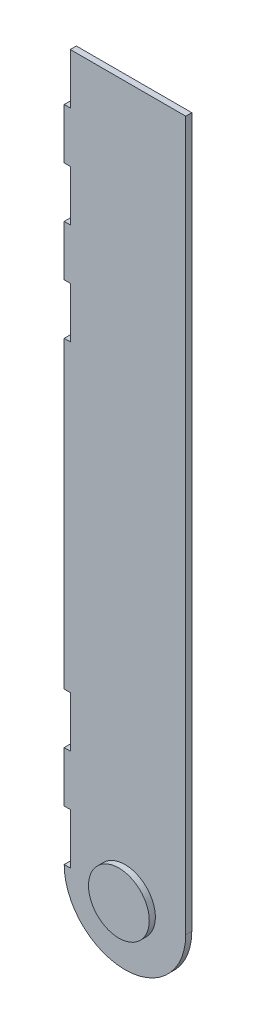
ISO-10303-21;
HEADER;
FILE_DESCRIPTION(('STEP AP214'),'2;1');
FILE_NAME('part.step','',(''),(''),'','','');
FILE_SCHEMA(('AUTOMOTIVE_DESIGN { 1 0 10303 214 1 1 1 1 }'));
ENDSEC;
DATA;
#1=APPLICATION_CONTEXT('core data for automotive mechanical design processes');
#2=APPLICATION_PROTOCOL_DEFINITION('international standard','automotive_design',2000,#1);
#3=PRODUCT_CONTEXT('',#1,'mechanical');
#4=PRODUCT('Part','Part','',(#3));
#5=PRODUCT_RELATED_PRODUCT_CATEGORY('part','',(#4));
#6=PRODUCT_DEFINITION_FORMATION('','',#4);
#7=PRODUCT_DEFINITION_CONTEXT('part definition',#1,'design');
#8=PRODUCT_DEFINITION('design','',#6,#7);
#9=PRODUCT_DEFINITION_SHAPE('','',#8);
#10=(LENGTH_UNIT() NAMED_UNIT(*) SI_UNIT(.MILLI.,.METRE.));
#11=(NAMED_UNIT(*) PLANE_ANGLE_UNIT() SI_UNIT($,.RADIAN.));
#12=(NAMED_UNIT(*) SI_UNIT($,.STERADIAN.) SOLID_ANGLE_UNIT());
#13=UNCERTAINTY_MEASURE_WITH_UNIT(LENGTH_MEASURE(1.E-05),#10,'distance_accuracy_value','');
#14=(GEOMETRIC_REPRESENTATION_CONTEXT(3) GLOBAL_UNCERTAINTY_ASSIGNED_CONTEXT((#13)) GLOBAL_UNIT_ASSIGNED_CONTEXT((#10,
#11,#12)) REPRESENTATION_CONTEXT('',''));
#15=CARTESIAN_POINT('',(0.,0.,0.));
#16=DIRECTION('',(0.,0.,1.));
#17=DIRECTION('',(1.,0.,0.));
#18=AXIS2_PLACEMENT_3D('',#15,#16,#17);
#19=CARTESIAN_POINT('',(0.,0.,3.));
#20=DIRECTION('',(1.,0.,0.));
#21=DIRECTION('',(0.,0.,-1.));
#22=AXIS2_PLACEMENT_3D('',#19,#20,#21);
#23=PLANE('',#22);
#24=DIRECTION('',(0.,-1.,0.));
#25=VECTOR('',#24,1.);
#26=CARTESIAN_POINT('',(0.,0.,0.));
#27=LINE('',#26,#25);
#28=CARTESIAN_POINT('',(0.,255.,0.));
#29=VERTEX_POINT('',#28);
#30=CARTESIAN_POINT('',(0.,105.,0.));
#31=VERTEX_POINT('',#30);
#32=EDGE_CURVE('E338',#29,#31,#27,.T.);
#33=ORIENTED_EDGE('',*,*,#32,.T.);
#34=DIRECTION('',(0.,0.,1.));
#35=VECTOR('',#34,1.);
#36=CARTESIAN_POINT('',(0.,105.,0.));
#37=LINE('',#36,#35);
#38=CARTESIAN_POINT('',(0.,105.,3.));
#39=VERTEX_POINT('',#38);
#40=EDGE_CURVE('E239',#31,#39,#37,.T.);
#41=ORIENTED_EDGE('',*,*,#40,.T.);
#42=DIRECTION('',(0.,-1.,0.));
#43=VECTOR('',#42,1.);
#44=CARTESIAN_POINT('',(0.,0.,3.));
#45=LINE('',#44,#43);
#46=CARTESIAN_POINT('',(0.,255.,3.));
#47=VERTEX_POINT('',#46);
#48=EDGE_CURVE('E326',#47,#39,#45,.T.);
#49=ORIENTED_EDGE('',*,*,#48,.F.);
#50=DIRECTION('',(0.,0.,1.));
#51=VECTOR('',#50,1.);
#52=CARTESIAN_POINT('',(0.,255.,0.));
#53=LINE('',#52,#51);
#54=EDGE_CURVE('E302',#29,#47,#53,.T.);
#55=ORIENTED_EDGE('',*,*,#54,.F.);
#56=EDGE_LOOP('',(#33,#41,#49,#55));
#57=FACE_BOUND('',#56,.T.);
#58=ADVANCED_FACE('F45',(#57),#23,.F.);
#59=CARTESIAN_POINT('',(0.,355.,3.));
#60=VERTEX_POINT('',#59);
#61=CARTESIAN_POINT('',(0.,330.,3.));
#62=VERTEX_POINT('',#61);
#63=EDGE_CURVE('E331',#60,#62,#45,.T.);
#64=ORIENTED_EDGE('',*,*,#63,.F.);
#65=DIRECTION('',(0.,0.,1.));
#66=VECTOR('',#65,1.);
#67=CARTESIAN_POINT('',(0.,355.,0.));
#68=LINE('',#67,#66);
#69=CARTESIAN_POINT('',(0.,355.,0.));
#70=VERTEX_POINT('',#69);
#71=EDGE_CURVE('E263',#70,#60,#68,.T.);
#72=ORIENTED_EDGE('',*,*,#71,.F.);
#73=CARTESIAN_POINT('',(0.,330.,0.));
#74=VERTEX_POINT('',#73);
#75=EDGE_CURVE('E343',#70,#74,#27,.T.);
#76=ORIENTED_EDGE('',*,*,#75,.T.);
#77=DIRECTION('',(0.,0.,1.));
#78=VECTOR('',#77,1.);
#79=CARTESIAN_POINT('',(0.,330.,0.));
#80=LINE('',#79,#78);
#81=EDGE_CURVE('E283',#74,#62,#80,.T.);
#82=ORIENTED_EDGE('',*,*,#81,.T.);
#83=EDGE_LOOP('',(#64,#72,#76,#82));
#84=FACE_BOUND('',#83,.T.);
#85=ADVANCED_FACE('F377',(#84),#23,.F.);
#86=CARTESIAN_POINT('',(0.,305.,3.));
#87=VERTEX_POINT('',#86);
#88=CARTESIAN_POINT('',(0.,280.,3.));
#89=VERTEX_POINT('',#88);
#90=EDGE_CURVE('E329',#87,#89,#45,.T.);
#91=ORIENTED_EDGE('',*,*,#90,.F.);
#92=DIRECTION('',(0.,0.,1.));
#93=VECTOR('',#92,1.);
#94=CARTESIAN_POINT('',(0.,305.,0.));
#95=LINE('',#94,#93);
#96=CARTESIAN_POINT('',(0.,305.,0.));
#97=VERTEX_POINT('',#96);
#98=EDGE_CURVE('E276',#97,#87,#95,.T.);
#99=ORIENTED_EDGE('',*,*,#98,.F.);
#100=CARTESIAN_POINT('',(0.,280.,0.));
#101=VERTEX_POINT('',#100);
#102=EDGE_CURVE('E341',#97,#101,#27,.T.);
#103=ORIENTED_EDGE('',*,*,#102,.T.);
#104=DIRECTION('',(0.,0.,1.));
#105=VECTOR('',#104,1.);
#106=CARTESIAN_POINT('',(0.,280.,0.));
#107=LINE('',#106,#105);
#108=EDGE_CURVE('E257',#101,#89,#107,.T.);
#109=ORIENTED_EDGE('',*,*,#108,.T.);
#110=EDGE_LOOP('',(#91,#99,#103,#109));
#111=FACE_BOUND('',#110,.T.);
#112=ADVANCED_FACE('F424',(#111),#23,.F.);
#113=CARTESIAN_POINT('',(0.,80.,0.));
#114=VERTEX_POINT('',#113);
#115=CARTESIAN_POINT('',(0.,55.,0.));
#116=VERTEX_POINT('',#115);
#117=EDGE_CURVE('E342',#114,#116,#27,.T.);
#118=ORIENTED_EDGE('',*,*,#117,.T.);
#119=DIRECTION('',(0.,0.,1.));
#120=VECTOR('',#119,1.);
#121=CARTESIAN_POINT('',(0.,55.,0.));
#122=LINE('',#121,#120);
#123=CARTESIAN_POINT('',(0.,55.,3.));
#124=VERTEX_POINT('',#123);
#125=EDGE_CURVE('E227',#116,#124,#122,.T.);
#126=ORIENTED_EDGE('',*,*,#125,.T.);
#127=CARTESIAN_POINT('',(0.,80.,3.));
#128=VERTEX_POINT('',#127);
#129=EDGE_CURVE('E330',#128,#124,#45,.T.);
#130=ORIENTED_EDGE('',*,*,#129,.F.);
#131=DIRECTION('',(0.,0.,1.));
#132=VECTOR('',#131,1.);
#133=CARTESIAN_POINT('',(0.,80.,0.));
#134=LINE('',#133,#132);
#135=EDGE_CURVE('E232',#114,#128,#134,.T.);
#136=ORIENTED_EDGE('',*,*,#135,.F.);
#137=EDGE_LOOP('',(#118,#126,#130,#136));
#138=FACE_BOUND('',#137,.T.);
#139=ADVANCED_FACE('F397',(#138),#23,.F.);
#140=CARTESIAN_POINT('',(60.,0.,3.));
#141=DIRECTION('',(-1.,0.,0.));
#142=DIRECTION('',(0.,0.,1.));
#143=AXIS2_PLACEMENT_3D('',#140,#141,#142);
#144=PLANE('',#143);
#145=DIRECTION('',(0.,1.,0.));
#146=VECTOR('',#145,1.);
#147=CARTESIAN_POINT('',(60.,0.,3.));
#148=LINE('',#147,#146);
#149=CARTESIAN_POINT('',(60.,30.,3.));
#150=VERTEX_POINT('',#149);
#151=CARTESIAN_POINT('',(60.,380.,3.));
#152=VERTEX_POINT('',#151);
#153=EDGE_CURVE('E332',#150,#152,#148,.T.);
#154=ORIENTED_EDGE('',*,*,#153,.F.);
#155=DIRECTION('',(0.,0.,-1.));
#156=VECTOR('',#155,1.);
#157=CARTESIAN_POINT('',(60.,30.,3.));
#158=LINE('',#157,#156);
#159=CARTESIAN_POINT('',(60.,30.,0.));
#160=VERTEX_POINT('',#159);
#161=EDGE_CURVE('E53',#150,#160,#158,.T.);
#162=ORIENTED_EDGE('',*,*,#161,.T.);
#163=DIRECTION('',(0.,1.,0.));
#164=VECTOR('',#163,1.);
#165=CARTESIAN_POINT('',(60.,0.,0.));
#166=LINE('',#165,#164);
#167=CARTESIAN_POINT('',(60.,380.,0.));
#168=VERTEX_POINT('',#167);
#169=EDGE_CURVE('E344',#160,#168,#166,.T.);
#170=ORIENTED_EDGE('',*,*,#169,.T.);
#171=DIRECTION('',(0.,0.,-1.));
#172=VECTOR('',#171,1.);
#173=CARTESIAN_POINT('',(60.,380.,3.));
#174=LINE('',#173,#172);
#175=EDGE_CURVE('E337',#152,#168,#174,.T.);
#176=ORIENTED_EDGE('',*,*,#175,.F.);
#177=EDGE_LOOP('',(#154,#162,#170,#176));
#178=FACE_BOUND('',#177,.T.);
#179=ADVANCED_FACE('F432',(#178),#144,.F.);
#180=CARTESIAN_POINT('',(0.,380.,3.));
#181=DIRECTION('',(0.,-1.,0.));
#182=DIRECTION('',(0.,0.,-1.));
#183=AXIS2_PLACEMENT_3D('',#180,#181,#182);
#184=PLANE('',#183);
#185=DIRECTION('',(-1.,0.,0.));
#186=VECTOR('',#185,1.);
#187=CARTESIAN_POINT('',(0.,380.,0.));
#188=LINE('',#187,#186);
#189=CARTESIAN_POINT('',(3.,380.,0.));
#190=VERTEX_POINT('',#189);
#191=EDGE_CURVE('E346',#168,#190,#188,.T.);
#192=ORIENTED_EDGE('',*,*,#191,.T.);
#193=DIRECTION('',(0.,0.,1.));
#194=VECTOR('',#193,1.);
#195=CARTESIAN_POINT('',(3.,380.,0.));
#196=LINE('',#195,#194);
#197=CARTESIAN_POINT('',(3.,380.,3.));
#198=VERTEX_POINT('',#197);
#199=EDGE_CURVE('E269',#190,#198,#196,.T.);
#200=ORIENTED_EDGE('',*,*,#199,.T.);
#201=DIRECTION('',(-1.,0.,0.));
#202=VECTOR('',#201,1.);
#203=CARTESIAN_POINT('',(0.,380.,3.));
#204=LINE('',#203,#202);
#205=EDGE_CURVE('E334',#152,#198,#204,.T.);
#206=ORIENTED_EDGE('',*,*,#205,.F.);
#207=ORIENTED_EDGE('',*,*,#175,.T.);
#208=EDGE_LOOP('',(#192,#200,#206,#207));
#209=FACE_BOUND('',#208,.T.);
#210=ADVANCED_FACE('F456',(#209),#184,.F.);
#211=CARTESIAN_POINT('',(0.,0.,3.));
#212=DIRECTION('',(0.,0.,-1.));
#213=DIRECTION('',(-1.,0.,0.));
#214=AXIS2_PLACEMENT_3D('',#211,#212,#213);
#215=PLANE('',#214);
#216=CARTESIAN_POINT('',(30.,30.,3.));
#217=DIRECTION('',(0.,0.,-1.));
#218=DIRECTION('',(-1.,0.,0.));
#219=AXIS2_PLACEMENT_3D('',#216,#217,#218);
#220=CIRCLE('',#219,15.);
#221=CARTESIAN_POINT('',(15.,30.,3.));
#222=VERTEX_POINT('',#221);
#223=EDGE_CURVE('E11',#222,#222,#220,.F.);
#224=ORIENTED_EDGE('',*,*,#223,.F.);
#225=EDGE_LOOP('',(#224));
#226=FACE_BOUND('',#225,.T.);
#227=ORIENTED_EDGE('',*,*,#129,.T.);
#228=DIRECTION('',(-1.,0.,0.));
#229=VECTOR('',#228,1.);
#230=CARTESIAN_POINT('',(0.,55.,3.));
#231=LINE('',#230,#229);
#232=CARTESIAN_POINT('',(3.,55.,3.));
#233=VERTEX_POINT('',#232);
#234=EDGE_CURVE('E218',#233,#124,#231,.T.);
#235=ORIENTED_EDGE('',*,*,#234,.F.);
#236=DIRECTION('',(0.,1.,0.));
#237=VECTOR('',#236,1.);
#238=CARTESIAN_POINT('',(3.,30.,3.));
#239=LINE('',#238,#237);
#240=CARTESIAN_POINT('',(3.,30.,3.));
#241=VERTEX_POINT('',#240);
#242=EDGE_CURVE('E220',#241,#233,#239,.T.);
#243=ORIENTED_EDGE('',*,*,#242,.F.);
#244=DIRECTION('',(1.,0.,0.));
#245=VECTOR('',#244,1.);
#246=CARTESIAN_POINT('',(0.,30.,3.));
#247=LINE('',#246,#245);
#248=CARTESIAN_POINT('',(0.,30.,3.));
#249=VERTEX_POINT('',#248);
#250=EDGE_CURVE('E200',#249,#241,#247,.T.);
#251=ORIENTED_EDGE('',*,*,#250,.F.);
#252=CARTESIAN_POINT('',(30.,30.,3.));
#253=DIRECTION('',(0.,0.,-1.));
#254=DIRECTION('',(-1.,0.,0.));
#255=AXIS2_PLACEMENT_3D('',#252,#253,#254);
#256=CIRCLE('',#255,30.);
#257=CARTESIAN_POINT('',(30.,0.,3.));
#258=VERTEX_POINT('',#257);
#259=EDGE_CURVE('E358',#249,#258,#256,.F.);
#260=ORIENTED_EDGE('',*,*,#259,.T.);
#261=CARTESIAN_POINT('',(30.,30.,3.));
#262=DIRECTION('',(0.,0.,-1.));
#263=DIRECTION('',(-1.,0.,0.));
#264=AXIS2_PLACEMENT_3D('',#261,#262,#263);
#265=CIRCLE('',#264,30.);
#266=EDGE_CURVE('E356',#258,#150,#265,.F.);
#267=ORIENTED_EDGE('',*,*,#266,.T.);
#268=ORIENTED_EDGE('',*,*,#153,.T.);
#269=ORIENTED_EDGE('',*,*,#205,.T.);
#270=DIRECTION('',(0.,1.,0.));
#271=VECTOR('',#270,1.);
#272=CARTESIAN_POINT('',(3.,380.,3.));
#273=LINE('',#272,#271);
#274=CARTESIAN_POINT('',(3.,355.,3.));
#275=VERTEX_POINT('',#274);
#276=EDGE_CURVE('E261',#275,#198,#273,.T.);
#277=ORIENTED_EDGE('',*,*,#276,.F.);
#278=DIRECTION('',(1.,0.,0.));
#279=VECTOR('',#278,1.);
#280=CARTESIAN_POINT('',(0.,355.,3.));
#281=LINE('',#280,#279);
#282=EDGE_CURVE('E264',#60,#275,#281,.T.);
#283=ORIENTED_EDGE('',*,*,#282,.F.);
#284=ORIENTED_EDGE('',*,*,#63,.T.);
#285=DIRECTION('',(-1.,0.,0.));
#286=VECTOR('',#285,1.);
#287=CARTESIAN_POINT('',(0.,330.,3.));
#288=LINE('',#287,#286);
#289=CARTESIAN_POINT('',(3.,330.,3.));
#290=VERTEX_POINT('',#289);
#291=EDGE_CURVE('E287',#290,#62,#288,.T.);
#292=ORIENTED_EDGE('',*,*,#291,.F.);
#293=DIRECTION('',(0.,1.,0.));
#294=VECTOR('',#293,1.);
#295=CARTESIAN_POINT('',(3.,330.,3.));
#296=LINE('',#295,#294);
#297=CARTESIAN_POINT('',(3.,305.,3.));
#298=VERTEX_POINT('',#297);
#299=EDGE_CURVE('E289',#298,#290,#296,.T.);
#300=ORIENTED_EDGE('',*,*,#299,.F.);
#301=DIRECTION('',(1.,0.,0.));
#302=VECTOR('',#301,1.);
#303=CARTESIAN_POINT('',(0.,305.,3.));
#304=LINE('',#303,#302);
#305=EDGE_CURVE('E267',#87,#298,#304,.T.);
#306=ORIENTED_EDGE('',*,*,#305,.F.);
#307=ORIENTED_EDGE('',*,*,#90,.T.);
#308=DIRECTION('',(-1.,0.,0.));
#309=VECTOR('',#308,1.);
#310=CARTESIAN_POINT('',(0.,280.,3.));
#311=LINE('',#310,#309);
#312=CARTESIAN_POINT('',(3.,280.,3.));
#313=VERTEX_POINT('',#312);
#314=EDGE_CURVE('E311',#313,#89,#311,.T.);
#315=ORIENTED_EDGE('',*,*,#314,.F.);
#316=DIRECTION('',(0.,1.,0.));
#317=VECTOR('',#316,1.);
#318=CARTESIAN_POINT('',(3.,280.,3.));
#319=LINE('',#318,#317);
#320=CARTESIAN_POINT('',(3.00000000000001,255.,3.));
#321=VERTEX_POINT('',#320);
#322=EDGE_CURVE('E313',#321,#313,#319,.T.);
#323=ORIENTED_EDGE('',*,*,#322,.F.);
#324=DIRECTION('',(1.,0.,0.));
#325=VECTOR('',#324,1.);
#326=CARTESIAN_POINT('',(0.,255.,3.));
#327=LINE('',#326,#325);
#328=EDGE_CURVE('E286',#47,#321,#327,.T.);
#329=ORIENTED_EDGE('',*,*,#328,.F.);
#330=ORIENTED_EDGE('',*,*,#48,.T.);
#331=DIRECTION('',(-1.,0.,0.));
#332=VECTOR('',#331,1.);
#333=CARTESIAN_POINT('',(0.,105.,3.));
#334=LINE('',#333,#332);
#335=CARTESIAN_POINT('',(3.,105.,3.));
#336=VERTEX_POINT('',#335);
#337=EDGE_CURVE('E242',#336,#39,#334,.T.);
#338=ORIENTED_EDGE('',*,*,#337,.F.);
#339=DIRECTION('',(0.,1.,0.));
#340=VECTOR('',#339,1.);
#341=CARTESIAN_POINT('',(3.,80.,3.));
#342=LINE('',#341,#340);
#343=CARTESIAN_POINT('',(3.,80.,3.));
#344=VERTEX_POINT('',#343);
#345=EDGE_CURVE('E244',#344,#336,#342,.T.);
#346=ORIENTED_EDGE('',*,*,#345,.F.);
#347=DIRECTION('',(1.,0.,0.));
#348=VECTOR('',#347,1.);
#349=CARTESIAN_POINT('',(0.,80.,3.));
#350=LINE('',#349,#348);
#351=EDGE_CURVE('E225',#128,#344,#350,.T.);
#352=ORIENTED_EDGE('',*,*,#351,.F.);
#353=EDGE_LOOP('',(#227,#235,#243,#251,#260,#267,#268,#269,#277,#283,#284,#292,#300,#306,#307,
#315,#323,#329,#330,#338,#346,#352));
#354=FACE_BOUND('',#353,.T.);
#355=ADVANCED_FACE('F386',(#226,#354),#215,.F.);
#356=CARTESIAN_POINT('',(0.,0.,0.));
#357=DIRECTION('',(0.,0.,-1.));
#358=DIRECTION('',(-1.,0.,0.));
#359=AXIS2_PLACEMENT_3D('',#356,#357,#358);
#360=PLANE('',#359);
#361=DIRECTION('',(-1.,0.,0.));
#362=VECTOR('',#361,1.);
#363=CARTESIAN_POINT('',(0.,55.,0.));
#364=LINE('',#363,#362);
#365=CARTESIAN_POINT('',(3.,55.,0.));
#366=VERTEX_POINT('',#365);
#367=EDGE_CURVE('E205',#366,#116,#364,.T.);
#368=ORIENTED_EDGE('',*,*,#367,.T.);
#369=ORIENTED_EDGE('',*,*,#117,.F.);
#370=DIRECTION('',(1.,0.,0.));
#371=VECTOR('',#370,1.);
#372=CARTESIAN_POINT('',(0.,80.,0.));
#373=LINE('',#372,#371);
#374=CARTESIAN_POINT('',(3.,80.,0.));
#375=VERTEX_POINT('',#374);
#376=EDGE_CURVE('E245',#114,#375,#373,.T.);
#377=ORIENTED_EDGE('',*,*,#376,.T.);
#378=DIRECTION('',(0.,1.,0.));
#379=VECTOR('',#378,1.);
#380=CARTESIAN_POINT('',(3.,80.,0.));
#381=LINE('',#380,#379);
#382=CARTESIAN_POINT('',(3.,105.,0.));
#383=VERTEX_POINT('',#382);
#384=EDGE_CURVE('E60',#375,#383,#381,.T.);
#385=ORIENTED_EDGE('',*,*,#384,.T.);
#386=DIRECTION('',(-1.,0.,0.));
#387=VECTOR('',#386,1.);
#388=CARTESIAN_POINT('',(0.,105.,0.));
#389=LINE('',#388,#387);
#390=EDGE_CURVE('E234',#383,#31,#389,.T.);
#391=ORIENTED_EDGE('',*,*,#390,.T.);
#392=ORIENTED_EDGE('',*,*,#32,.F.);
#393=DIRECTION('',(1.,0.,0.));
#394=VECTOR('',#393,1.);
#395=CARTESIAN_POINT('',(0.,255.,0.));
#396=LINE('',#395,#394);
#397=CARTESIAN_POINT('',(3.00000000000001,255.,0.));
#398=VERTEX_POINT('',#397);
#399=EDGE_CURVE('E314',#29,#398,#396,.T.);
#400=ORIENTED_EDGE('',*,*,#399,.T.);
#401=DIRECTION('',(0.,1.,0.));
#402=VECTOR('',#401,1.);
#403=CARTESIAN_POINT('',(3.,280.,0.));
#404=LINE('',#403,#402);
#405=CARTESIAN_POINT('',(3.,280.,0.));
#406=VERTEX_POINT('',#405);
#407=EDGE_CURVE('E321',#398,#406,#404,.T.);
#408=ORIENTED_EDGE('',*,*,#407,.T.);
#409=DIRECTION('',(-1.,0.,0.));
#410=VECTOR('',#409,1.);
#411=CARTESIAN_POINT('',(0.,280.,0.));
#412=LINE('',#411,#410);
#413=EDGE_CURVE('E304',#406,#101,#412,.T.);
#414=ORIENTED_EDGE('',*,*,#413,.T.);
#415=ORIENTED_EDGE('',*,*,#102,.F.);
#416=DIRECTION('',(1.,0.,0.));
#417=VECTOR('',#416,1.);
#418=CARTESIAN_POINT('',(0.,305.,0.));
#419=LINE('',#418,#417);
#420=CARTESIAN_POINT('',(3.,305.,0.));
#421=VERTEX_POINT('',#420);
#422=EDGE_CURVE('E290',#97,#421,#419,.T.);
#423=ORIENTED_EDGE('',*,*,#422,.T.);
#424=DIRECTION('',(0.,1.,0.));
#425=VECTOR('',#424,1.);
#426=CARTESIAN_POINT('',(3.,330.,0.));
#427=LINE('',#426,#425);
#428=CARTESIAN_POINT('',(3.,330.,0.));
#429=VERTEX_POINT('',#428);
#430=EDGE_CURVE('E297',#421,#429,#427,.T.);
#431=ORIENTED_EDGE('',*,*,#430,.T.);
#432=DIRECTION('',(-1.,0.,0.));
#433=VECTOR('',#432,1.);
#434=CARTESIAN_POINT('',(0.,330.,0.));
#435=LINE('',#434,#433);
#436=EDGE_CURVE('E278',#429,#74,#435,.T.);
#437=ORIENTED_EDGE('',*,*,#436,.T.);
#438=ORIENTED_EDGE('',*,*,#75,.F.);
#439=DIRECTION('',(1.,0.,0.));
#440=VECTOR('',#439,1.);
#441=CARTESIAN_POINT('',(0.,355.,0.));
#442=LINE('',#441,#440);
#443=CARTESIAN_POINT('',(3.,355.,0.));
#444=VERTEX_POINT('',#443);
#445=EDGE_CURVE('E258',#70,#444,#442,.T.);
#446=ORIENTED_EDGE('',*,*,#445,.T.);
#447=DIRECTION('',(0.,1.,0.));
#448=VECTOR('',#447,1.);
#449=CARTESIAN_POINT('',(3.,380.,0.));
#450=LINE('',#449,#448);
#451=EDGE_CURVE('E68',#444,#190,#450,.T.);
#452=ORIENTED_EDGE('',*,*,#451,.T.);
#453=ORIENTED_EDGE('',*,*,#191,.F.);
#454=ORIENTED_EDGE('',*,*,#169,.F.);
#455=CARTESIAN_POINT('',(30.,30.,0.));
#456=DIRECTION('',(0.,0.,-1.));
#457=DIRECTION('',(-1.,0.,0.));
#458=AXIS2_PLACEMENT_3D('',#455,#456,#457);
#459=CIRCLE('',#458,30.);
#460=CARTESIAN_POINT('',(30.,0.,0.));
#461=VERTEX_POINT('',#460);
#462=EDGE_CURVE('E351',#160,#461,#459,.T.);
#463=ORIENTED_EDGE('',*,*,#462,.T.);
#464=CARTESIAN_POINT('',(30.,30.,0.));
#465=DIRECTION('',(0.,0.,-1.));
#466=DIRECTION('',(-1.,0.,0.));
#467=AXIS2_PLACEMENT_3D('',#464,#465,#466);
#468=CIRCLE('',#467,30.);
#469=CARTESIAN_POINT('',(0.,30.,0.));
#470=VERTEX_POINT('',#469);
#471=EDGE_CURVE('E216',#461,#470,#468,.T.);
#472=ORIENTED_EDGE('',*,*,#471,.T.);
#473=DIRECTION('',(1.,0.,0.));
#474=VECTOR('',#473,1.);
#475=CARTESIAN_POINT('',(0.,30.,0.));
#476=LINE('',#475,#474);
#477=CARTESIAN_POINT('',(3.,30.,0.));
#478=VERTEX_POINT('',#477);
#479=EDGE_CURVE('E197',#470,#478,#476,.T.);
#480=ORIENTED_EDGE('',*,*,#479,.T.);
#481=DIRECTION('',(0.,1.,0.));
#482=VECTOR('',#481,1.);
#483=CARTESIAN_POINT('',(3.,30.,0.));
#484=LINE('',#483,#482);
#485=EDGE_CURVE('E208',#478,#366,#484,.T.);
#486=ORIENTED_EDGE('',*,*,#485,.T.);
#487=EDGE_LOOP('',(#368,#369,#377,#385,#391,#392,#400,#408,#414,#415,#423,#431,#437,#438,#446,
#452,#453,#454,#463,#472,#480,#486));
#488=FACE_BOUND('',#487,.T.);
#489=ADVANCED_FACE('F214',(#488),#360,.T.);
#490=CARTESIAN_POINT('',(30.,30.,3.));
#491=DIRECTION('',(0.,0.,-1.));
#492=DIRECTION('',(-1.,0.,0.));
#493=AXIS2_PLACEMENT_3D('',#490,#491,#492);
#494=CYLINDRICAL_SURFACE('',#493,30.);
#495=ORIENTED_EDGE('',*,*,#161,.F.);
#496=ORIENTED_EDGE('',*,*,#266,.F.);
#497=DIRECTION('',(0.,0.,-1.));
#498=VECTOR('',#497,1.);
#499=CARTESIAN_POINT('',(30.,0.,3.));
#500=LINE('',#499,#498);
#501=EDGE_CURVE('E272',#461,#258,#500,.F.);
#502=ORIENTED_EDGE('',*,*,#501,.F.);
#503=ORIENTED_EDGE('',*,*,#462,.F.);
#504=EDGE_LOOP('',(#495,#496,#502,#503));
#505=FACE_BOUND('',#504,.T.);
#506=ADVANCED_FACE('F47',(#505),#494,.T.);
#507=CARTESIAN_POINT('',(30.,30.,3.));
#508=DIRECTION('',(0.,0.,-1.));
#509=DIRECTION('',(-1.,0.,0.));
#510=AXIS2_PLACEMENT_3D('',#507,#508,#509);
#511=CYLINDRICAL_SURFACE('',#510,30.);
#512=ORIENTED_EDGE('',*,*,#259,.F.);
#513=DIRECTION('',(0.,0.,-1.));
#514=VECTOR('',#513,1.);
#515=CARTESIAN_POINT('',(0.,30.,3.));
#516=LINE('',#515,#514);
#517=EDGE_CURVE('E354',#470,#249,#516,.F.);
#518=ORIENTED_EDGE('',*,*,#517,.F.);
#519=ORIENTED_EDGE('',*,*,#471,.F.);
#520=ORIENTED_EDGE('',*,*,#501,.T.);
#521=EDGE_LOOP('',(#512,#518,#519,#520));
#522=FACE_BOUND('',#521,.T.);
#523=ADVANCED_FACE('F471',(#522),#511,.T.);
#524=CARTESIAN_POINT('',(0.,280.,0.));
#525=DIRECTION('',(0.,1.,0.));
#526=DIRECTION('',(0.,0.,1.));
#527=AXIS2_PLACEMENT_3D('',#524,#525,#526);
#528=PLANE('',#527);
#529=ORIENTED_EDGE('',*,*,#314,.T.);
#530=ORIENTED_EDGE('',*,*,#108,.F.);
#531=ORIENTED_EDGE('',*,*,#413,.F.);
#532=DIRECTION('',(0.,0.,1.));
#533=VECTOR('',#532,1.);
#534=CARTESIAN_POINT('',(3.,280.,0.));
#535=LINE('',#534,#533);
#536=EDGE_CURVE('E307',#406,#313,#535,.T.);
#537=ORIENTED_EDGE('',*,*,#536,.T.);
#538=EDGE_LOOP('',(#529,#530,#531,#537));
#539=FACE_BOUND('',#538,.T.);
#540=ADVANCED_FACE('F420',(#539),#528,.F.);
#541=CARTESIAN_POINT('',(3.,280.,0.));
#542=DIRECTION('',(1.,0.,0.));
#543=DIRECTION('',(0.,1.,0.));
#544=AXIS2_PLACEMENT_3D('',#541,#542,#543);
#545=PLANE('',#544);
#546=ORIENTED_EDGE('',*,*,#322,.T.);
#547=ORIENTED_EDGE('',*,*,#536,.F.);
#548=ORIENTED_EDGE('',*,*,#407,.F.);
#549=DIRECTION('',(0.,0.,1.));
#550=VECTOR('',#549,1.);
#551=CARTESIAN_POINT('',(3.00000000000001,255.,0.));
#552=LINE('',#551,#550);
#553=EDGE_CURVE('E305',#398,#321,#552,.T.);
#554=ORIENTED_EDGE('',*,*,#553,.T.);
#555=EDGE_LOOP('',(#546,#547,#548,#554));
#556=FACE_BOUND('',#555,.T.);
#557=ADVANCED_FACE('F417',(#556),#545,.F.);
#558=CARTESIAN_POINT('',(0.,255.,0.));
#559=DIRECTION('',(0.,-1.,0.));
#560=DIRECTION('',(0.,0.,-1.));
#561=AXIS2_PLACEMENT_3D('',#558,#559,#560);
#562=PLANE('',#561);
#563=ORIENTED_EDGE('',*,*,#328,.T.);
#564=ORIENTED_EDGE('',*,*,#553,.F.);
#565=ORIENTED_EDGE('',*,*,#399,.F.);
#566=ORIENTED_EDGE('',*,*,#54,.T.);
#567=EDGE_LOOP('',(#563,#564,#565,#566));
#568=FACE_BOUND('',#567,.T.);
#569=ADVANCED_FACE('F414',(#568),#562,.F.);
#570=CARTESIAN_POINT('',(0.,330.,0.));
#571=DIRECTION('',(0.,1.,0.));
#572=DIRECTION('',(0.,0.,1.));
#573=AXIS2_PLACEMENT_3D('',#570,#571,#572);
#574=PLANE('',#573);
#575=ORIENTED_EDGE('',*,*,#291,.T.);
#576=ORIENTED_EDGE('',*,*,#81,.F.);
#577=ORIENTED_EDGE('',*,*,#436,.F.);
#578=DIRECTION('',(0.,0.,1.));
#579=VECTOR('',#578,1.);
#580=CARTESIAN_POINT('',(3.,330.,0.));
#581=LINE('',#580,#579);
#582=EDGE_CURVE('E281',#429,#290,#581,.T.);
#583=ORIENTED_EDGE('',*,*,#582,.T.);
#584=EDGE_LOOP('',(#575,#576,#577,#583));
#585=FACE_BOUND('',#584,.T.);
#586=ADVANCED_FACE('F381',(#585),#574,.F.);
#587=CARTESIAN_POINT('',(3.,330.,0.));
#588=DIRECTION('',(1.,0.,0.));
#589=DIRECTION('',(0.,1.,0.));
#590=AXIS2_PLACEMENT_3D('',#587,#588,#589);
#591=PLANE('',#590);
#592=ORIENTED_EDGE('',*,*,#299,.T.);
#593=ORIENTED_EDGE('',*,*,#582,.F.);
#594=ORIENTED_EDGE('',*,*,#430,.F.);
#595=DIRECTION('',(0.,0.,1.));
#596=VECTOR('',#595,1.);
#597=CARTESIAN_POINT('',(3.,305.,0.));
#598=LINE('',#597,#596);
#599=EDGE_CURVE('E279',#421,#298,#598,.T.);
#600=ORIENTED_EDGE('',*,*,#599,.T.);
#601=EDGE_LOOP('',(#592,#593,#594,#600));
#602=FACE_BOUND('',#601,.T.);
#603=ADVANCED_FACE('F540',(#602),#591,.F.);
#604=CARTESIAN_POINT('',(0.,305.,0.));
#605=DIRECTION('',(0.,-1.,0.));
#606=DIRECTION('',(0.,0.,-1.));
#607=AXIS2_PLACEMENT_3D('',#604,#605,#606);
#608=PLANE('',#607);
#609=ORIENTED_EDGE('',*,*,#305,.T.);
#610=ORIENTED_EDGE('',*,*,#599,.F.);
#611=ORIENTED_EDGE('',*,*,#422,.F.);
#612=ORIENTED_EDGE('',*,*,#98,.T.);
#613=EDGE_LOOP('',(#609,#610,#611,#612));
#614=FACE_BOUND('',#613,.T.);
#615=ADVANCED_FACE('F423',(#614),#608,.F.);
#616=CARTESIAN_POINT('',(3.,380.,0.));
#617=DIRECTION('',(1.,0.,0.));
#618=DIRECTION('',(0.,1.,0.));
#619=AXIS2_PLACEMENT_3D('',#616,#617,#618);
#620=PLANE('',#619);
#621=ORIENTED_EDGE('',*,*,#276,.T.);
#622=ORIENTED_EDGE('',*,*,#199,.F.);
#623=ORIENTED_EDGE('',*,*,#451,.F.);
#624=DIRECTION('',(0.,0.,1.));
#625=VECTOR('',#624,1.);
#626=CARTESIAN_POINT('',(3.,355.,0.));
#627=LINE('',#626,#625);
#628=EDGE_CURVE('E273',#444,#275,#627,.T.);
#629=ORIENTED_EDGE('',*,*,#628,.T.);
#630=EDGE_LOOP('',(#621,#622,#623,#629));
#631=FACE_BOUND('',#630,.T.);
#632=ADVANCED_FACE('F532',(#631),#620,.F.);
#633=CARTESIAN_POINT('',(0.,355.,0.));
#634=DIRECTION('',(0.,-1.,0.));
#635=DIRECTION('',(0.,0.,-1.));
#636=AXIS2_PLACEMENT_3D('',#633,#634,#635);
#637=PLANE('',#636);
#638=ORIENTED_EDGE('',*,*,#282,.T.);
#639=ORIENTED_EDGE('',*,*,#628,.F.);
#640=ORIENTED_EDGE('',*,*,#445,.F.);
#641=ORIENTED_EDGE('',*,*,#71,.T.);
#642=EDGE_LOOP('',(#638,#639,#640,#641));
#643=FACE_BOUND('',#642,.T.);
#644=ADVANCED_FACE('F530',(#643),#637,.F.);
#645=CARTESIAN_POINT('',(30.,30.,6.));
#646=DIRECTION('',(0.,0.,-1.));
#647=DIRECTION('',(-1.,0.,0.));
#648=AXIS2_PLACEMENT_3D('',#645,#646,#647);
#649=CYLINDRICAL_SURFACE('',#648,15.);
#650=CARTESIAN_POINT('',(30.,30.,6.));
#651=DIRECTION('',(0.,0.,1.));
#652=DIRECTION('',(1.,0.,0.));
#653=AXIS2_PLACEMENT_3D('',#650,#651,#652);
#654=CIRCLE('',#653,15.);
#655=CARTESIAN_POINT('',(45.,30.,6.));
#656=VERTEX_POINT('',#655);
#657=EDGE_CURVE('E230',#656,#656,#654,.T.);
#658=ORIENTED_EDGE('',*,*,#657,.F.);
#659=EDGE_LOOP('',(#658));
#660=FACE_BOUND('',#659,.T.);
#661=ORIENTED_EDGE('',*,*,#223,.T.);
#662=EDGE_LOOP('',(#661));
#663=FACE_BOUND('',#662,.T.);
#664=ADVANCED_FACE('F527',(#660,#663),#649,.T.);
#665=CARTESIAN_POINT('',(30.,30.,6.));
#666=DIRECTION('',(0.,0.,1.));
#667=DIRECTION('',(1.,0.,0.));
#668=AXIS2_PLACEMENT_3D('',#665,#666,#667);
#669=PLANE('',#668);
#670=ORIENTED_EDGE('',*,*,#657,.T.);
#671=EDGE_LOOP('',(#670));
#672=FACE_BOUND('',#671,.T.);
#673=ADVANCED_FACE('F442',(#672),#669,.T.);
#674=CARTESIAN_POINT('',(0.,55.,0.));
#675=DIRECTION('',(0.,1.,0.));
#676=DIRECTION('',(0.,0.,1.));
#677=AXIS2_PLACEMENT_3D('',#674,#675,#676);
#678=PLANE('',#677);
#679=ORIENTED_EDGE('',*,*,#234,.T.);
#680=ORIENTED_EDGE('',*,*,#125,.F.);
#681=ORIENTED_EDGE('',*,*,#367,.F.);
#682=DIRECTION('',(0.,0.,1.));
#683=VECTOR('',#682,1.);
#684=CARTESIAN_POINT('',(3.,55.,0.));
#685=LINE('',#684,#683);
#686=EDGE_CURVE('E204',#366,#233,#685,.T.);
#687=ORIENTED_EDGE('',*,*,#686,.T.);
#688=EDGE_LOOP('',(#679,#680,#681,#687));
#689=FACE_BOUND('',#688,.T.);
#690=ADVANCED_FACE('F399',(#689),#678,.F.);
#691=CARTESIAN_POINT('',(3.,30.,0.));
#692=DIRECTION('',(1.,0.,0.));
#693=DIRECTION('',(0.,0.,-1.));
#694=AXIS2_PLACEMENT_3D('',#691,#692,#693);
#695=PLANE('',#694);
#696=ORIENTED_EDGE('',*,*,#242,.T.);
#697=ORIENTED_EDGE('',*,*,#686,.F.);
#698=ORIENTED_EDGE('',*,*,#485,.F.);
#699=DIRECTION('',(0.,0.,1.));
#700=VECTOR('',#699,1.);
#701=CARTESIAN_POINT('',(3.,30.,0.));
#702=LINE('',#701,#700);
#703=EDGE_CURVE('E193',#478,#241,#702,.T.);
#704=ORIENTED_EDGE('',*,*,#703,.T.);
#705=EDGE_LOOP('',(#696,#697,#698,#704));
#706=FACE_BOUND('',#705,.T.);
#707=ADVANCED_FACE('F209',(#706),#695,.F.);
#708=CARTESIAN_POINT('',(0.,30.,0.));
#709=DIRECTION('',(0.,-1.,0.));
#710=DIRECTION('',(0.,0.,-1.));
#711=AXIS2_PLACEMENT_3D('',#708,#709,#710);
#712=PLANE('',#711);
#713=ORIENTED_EDGE('',*,*,#250,.T.);
#714=ORIENTED_EDGE('',*,*,#703,.F.);
#715=ORIENTED_EDGE('',*,*,#479,.F.);
#716=ORIENTED_EDGE('',*,*,#517,.T.);
#717=EDGE_LOOP('',(#713,#714,#715,#716));
#718=FACE_BOUND('',#717,.T.);
#719=ADVANCED_FACE('F195',(#718),#712,.F.);
#720=CARTESIAN_POINT('',(0.,105.,0.));
#721=DIRECTION('',(0.,1.,0.));
#722=DIRECTION('',(0.,0.,1.));
#723=AXIS2_PLACEMENT_3D('',#720,#721,#722);
#724=PLANE('',#723);
#725=ORIENTED_EDGE('',*,*,#337,.T.);
#726=ORIENTED_EDGE('',*,*,#40,.F.);
#727=ORIENTED_EDGE('',*,*,#390,.F.);
#728=DIRECTION('',(0.,0.,1.));
#729=VECTOR('',#728,1.);
#730=CARTESIAN_POINT('',(3.,105.,0.));
#731=LINE('',#730,#729);
#732=EDGE_CURVE('E237',#383,#336,#731,.T.);
#733=ORIENTED_EDGE('',*,*,#732,.T.);
#734=EDGE_LOOP('',(#725,#726,#727,#733));
#735=FACE_BOUND('',#734,.T.);
#736=ADVANCED_FACE('F408',(#735),#724,.F.);
#737=CARTESIAN_POINT('',(3.,80.,0.));
#738=DIRECTION('',(1.,0.,0.));
#739=DIRECTION('',(0.,0.,-1.));
#740=AXIS2_PLACEMENT_3D('',#737,#738,#739);
#741=PLANE('',#740);
#742=ORIENTED_EDGE('',*,*,#345,.T.);
#743=ORIENTED_EDGE('',*,*,#732,.F.);
#744=ORIENTED_EDGE('',*,*,#384,.F.);
#745=DIRECTION('',(0.,0.,1.));
#746=VECTOR('',#745,1.);
#747=CARTESIAN_POINT('',(3.,80.,0.));
#748=LINE('',#747,#746);
#749=EDGE_CURVE('E235',#375,#344,#748,.T.);
#750=ORIENTED_EDGE('',*,*,#749,.T.);
#751=EDGE_LOOP('',(#742,#743,#744,#750));
#752=FACE_BOUND('',#751,.T.);
#753=ADVANCED_FACE('F402',(#752),#741,.F.);
#754=CARTESIAN_POINT('',(0.,80.,0.));
#755=DIRECTION('',(0.,-1.,0.));
#756=DIRECTION('',(1.,0.,0.));
#757=AXIS2_PLACEMENT_3D('',#754,#755,#756);
#758=PLANE('',#757);
#759=ORIENTED_EDGE('',*,*,#351,.T.);
#760=ORIENTED_EDGE('',*,*,#749,.F.);
#761=ORIENTED_EDGE('',*,*,#376,.F.);
#762=ORIENTED_EDGE('',*,*,#135,.T.);
#763=EDGE_LOOP('',(#759,#760,#761,#762));
#764=FACE_BOUND('',#763,.T.);
#765=ADVANCED_FACE('F401',(#764),#758,.F.);
#766=CLOSED_SHELL('',(#58,#85,#112,#139,#179,#210,#355,#489,#506,#523,#540,#557,#569,#586,#603,
#615,#632,#644,#664,#673,#690,#707,#719,#736,#753,#765));
#767=MANIFOLD_SOLID_BREP('B2',#766);
#768=ADVANCED_BREP_SHAPE_REPRESENTATION('',(#18,#767),#14);
#769=SHAPE_DEFINITION_REPRESENTATION(#9,#768);
ENDSEC;
END-ISO-10303-21;
